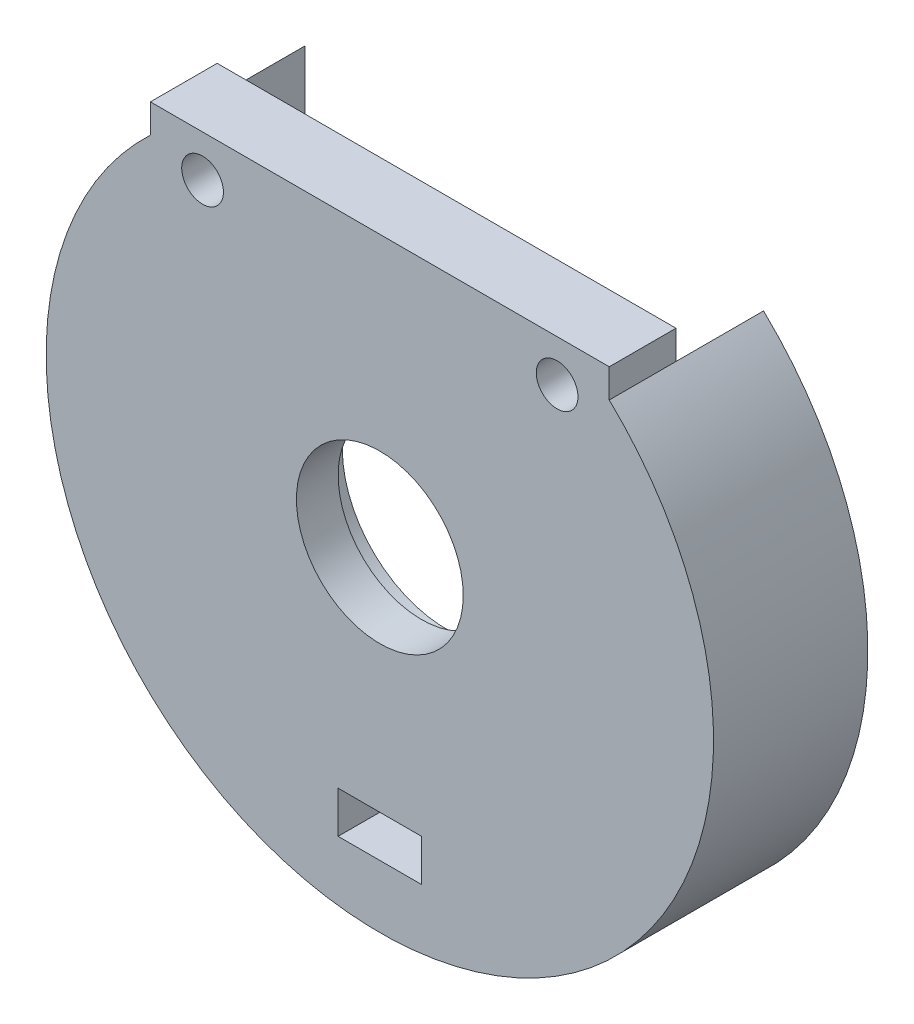
ISO-10303-21;
HEADER;
FILE_DESCRIPTION(('STEP AP214'),'2;1');
FILE_NAME('part.step','',(''),(''),'','','');
FILE_SCHEMA(('AUTOMOTIVE_DESIGN { 1 0 10303 214 1 1 1 1 }'));
ENDSEC;
DATA;
#1=APPLICATION_CONTEXT('core data for automotive mechanical design processes');
#2=APPLICATION_PROTOCOL_DEFINITION('international standard','automotive_design',2000,#1);
#3=PRODUCT_CONTEXT('',#1,'mechanical');
#4=PRODUCT('Part','Part','',(#3));
#5=PRODUCT_RELATED_PRODUCT_CATEGORY('part','',(#4));
#6=PRODUCT_DEFINITION_FORMATION('','',#4);
#7=PRODUCT_DEFINITION_CONTEXT('part definition',#1,'design');
#8=PRODUCT_DEFINITION('design','',#6,#7);
#9=PRODUCT_DEFINITION_SHAPE('','',#8);
#10=(LENGTH_UNIT() NAMED_UNIT(*) SI_UNIT(.MILLI.,.METRE.));
#11=(NAMED_UNIT(*) PLANE_ANGLE_UNIT() SI_UNIT($,.RADIAN.));
#12=(NAMED_UNIT(*) SI_UNIT($,.STERADIAN.) SOLID_ANGLE_UNIT());
#13=UNCERTAINTY_MEASURE_WITH_UNIT(LENGTH_MEASURE(1.E-05),#10,'distance_accuracy_value','');
#14=(GEOMETRIC_REPRESENTATION_CONTEXT(3) GLOBAL_UNCERTAINTY_ASSIGNED_CONTEXT((#13)) GLOBAL_UNIT_ASSIGNED_CONTEXT((#10,
#11,#12)) REPRESENTATION_CONTEXT('',''));
#15=CARTESIAN_POINT('',(0.,0.,0.));
#16=DIRECTION('',(0.,0.,1.));
#17=DIRECTION('',(1.,0.,0.));
#18=AXIS2_PLACEMENT_3D('',#15,#16,#17);
#19=CARTESIAN_POINT('',(-5.49999999999999,-2.50000000000145,1.4));
#20=DIRECTION('',(-0.707106781186376,-0.707106781186719,0.));
#21=DIRECTION('',(0.707106781186719,-0.707106781186376,0.));
#22=AXIS2_PLACEMENT_3D('',#19,#20,#21);
#23=PLANE('',#22);
#24=DIRECTION('',(-0.707106781186719,0.707106781186376,0.));
#25=VECTOR('',#24,1.);
#26=CARTESIAN_POINT('',(-5.49999999999999,-2.50000000000145,0.));
#27=LINE('',#26,#25);
#28=CARTESIAN_POINT('',(-2.49999999999999,-5.5,0.));
#29=VERTEX_POINT('',#28);
#30=CARTESIAN_POINT('',(-5.49999999999999,-2.50000000000145,0.));
#31=VERTEX_POINT('',#30);
#32=EDGE_CURVE('E235',#29,#31,#27,.T.);
#33=ORIENTED_EDGE('',*,*,#32,.T.);
#34=DIRECTION('',(0.,0.,-1.));
#35=VECTOR('',#34,1.);
#36=CARTESIAN_POINT('',(-5.49999999999999,-2.50000000000145,1.4));
#37=LINE('',#36,#35);
#38=CARTESIAN_POINT('',(-5.49999999999999,-2.50000000000145,2.09999999999996));
#39=VERTEX_POINT('',#38);
#40=EDGE_CURVE('E11',#39,#31,#37,.T.);
#41=ORIENTED_EDGE('',*,*,#40,.F.);
#42=DIRECTION('',(-0.707106781186719,0.707106781186376,0.));
#43=VECTOR('',#42,1.);
#44=CARTESIAN_POINT('',(-5.49999999999999,-2.50000000000145,2.09999999999997));
#45=LINE('',#44,#43);
#46=CARTESIAN_POINT('',(-2.49999999999999,-5.5,2.09999999999997));
#47=VERTEX_POINT('',#46);
#48=EDGE_CURVE('E245',#47,#39,#45,.T.);
#49=ORIENTED_EDGE('',*,*,#48,.F.);
#50=DIRECTION('',(0.,0.,-1.));
#51=VECTOR('',#50,1.);
#52=CARTESIAN_POINT('',(-2.49999999999999,-5.5,1.4));
#53=LINE('',#52,#51);
#54=EDGE_CURVE('E257',#47,#29,#53,.T.);
#55=ORIENTED_EDGE('',*,*,#54,.T.);
#56=EDGE_LOOP('',(#33,#41,#49,#55));
#57=FACE_BOUND('',#56,.T.);
#58=ADVANCED_FACE('F35',(#57),#23,.F.);
#59=CARTESIAN_POINT('',(-5.49999999999999,5.80947501931113,1.4));
#60=DIRECTION('',(-1.,0.,0.));
#61=DIRECTION('',(0.,-1.,0.));
#62=AXIS2_PLACEMENT_3D('',#59,#60,#61);
#63=PLANE('',#62);
#64=DIRECTION('',(0.,1.,0.));
#65=VECTOR('',#64,1.);
#66=CARTESIAN_POINT('',(-5.49999999999999,5.80947501931113,0.));
#67=LINE('',#66,#65);
#68=CARTESIAN_POINT('',(-5.49999999999999,5.80947501931113,0.));
#69=VERTEX_POINT('',#68);
#70=EDGE_CURVE('E261',#31,#69,#67,.T.);
#71=ORIENTED_EDGE('',*,*,#70,.T.);
#72=DIRECTION('',(0.,0.,-1.));
#73=VECTOR('',#72,1.);
#74=CARTESIAN_POINT('',(-5.49999999999999,5.80947501931113,1.4));
#75=LINE('',#74,#73);
#76=CARTESIAN_POINT('',(-5.49999999999999,5.80947501931113,2.09999999999996));
#77=VERTEX_POINT('',#76);
#78=EDGE_CURVE('E42',#77,#69,#75,.T.);
#79=ORIENTED_EDGE('',*,*,#78,.F.);
#80=DIRECTION('',(0.,1.,0.));
#81=VECTOR('',#80,1.);
#82=CARTESIAN_POINT('',(-5.49999999999999,-2.50000000000145,2.09999999999996));
#83=LINE('',#82,#81);
#84=EDGE_CURVE('E242',#39,#77,#83,.T.);
#85=ORIENTED_EDGE('',*,*,#84,.F.);
#86=ORIENTED_EDGE('',*,*,#40,.T.);
#87=EDGE_LOOP('',(#71,#79,#85,#86));
#88=FACE_BOUND('',#87,.T.);
#89=ADVANCED_FACE('F315',(#88),#63,.F.);
#90=CARTESIAN_POINT('',(0.,0.,1.4));
#91=DIRECTION('',(0.,0.,-1.));
#92=DIRECTION('',(-1.,0.,0.));
#93=AXIS2_PLACEMENT_3D('',#90,#91,#92);
#94=CYLINDRICAL_SURFACE('',#93,8.);
#95=CARTESIAN_POINT('',(0.,0.,0.));
#96=DIRECTION('',(0.,0.,1.));
#97=DIRECTION('',(1.,0.,0.));
#98=AXIS2_PLACEMENT_3D('',#95,#96,#97);
#99=CIRCLE('',#98,8.);
#100=CARTESIAN_POINT('',(5.50000000000001,5.80947501931112,0.));
#101=VERTEX_POINT('',#100);
#102=EDGE_CURVE('E263',#69,#101,#99,.T.);
#103=ORIENTED_EDGE('',*,*,#102,.T.);
#104=DIRECTION('',(0.,0.,-1.));
#105=VECTOR('',#104,1.);
#106=CARTESIAN_POINT('',(5.50000000000001,5.80947501931112,1.4));
#107=LINE('',#106,#105);
#108=CARTESIAN_POINT('',(5.50000000000001,5.80947501931111,2.09999999999996));
#109=VERTEX_POINT('',#108);
#110=EDGE_CURVE('E278',#109,#101,#107,.T.);
#111=ORIENTED_EDGE('',*,*,#110,.F.);
#112=DIRECTION('',(0.,0.,-1.));
#113=VECTOR('',#112,1.);
#114=CARTESIAN_POINT('',(5.5,5.80947501931111,24.2928228816891));
#115=LINE('',#114,#113);
#116=CARTESIAN_POINT('',(5.50000000000001,5.80947501931111,3.69999999999996));
#117=VERTEX_POINT('',#116);
#118=EDGE_CURVE('E210',#117,#109,#115,.T.);
#119=ORIENTED_EDGE('',*,*,#118,.F.);
#120=CARTESIAN_POINT('',(0.,0.,3.69999999999996));
#121=DIRECTION('',(0.,0.,1.));
#122=DIRECTION('',(1.,0.,0.));
#123=AXIS2_PLACEMENT_3D('',#120,#121,#122);
#124=CIRCLE('',#123,8.);
#125=CARTESIAN_POINT('',(-5.49999999999999,5.80947501931113,3.69999999999996));
#126=VERTEX_POINT('',#125);
#127=EDGE_CURVE('E175',#126,#117,#124,.T.);
#128=ORIENTED_EDGE('',*,*,#127,.F.);
#129=DIRECTION('',(0.,0.,-1.));
#130=VECTOR('',#129,1.);
#131=CARTESIAN_POINT('',(-5.5,5.80947501931113,24.2928228816891));
#132=LINE('',#131,#130);
#133=EDGE_CURVE('E214',#126,#77,#132,.T.);
#134=ORIENTED_EDGE('',*,*,#133,.T.);
#135=ORIENTED_EDGE('',*,*,#78,.T.);
#136=EDGE_LOOP('',(#103,#111,#119,#128,#134,#135));
#137=FACE_BOUND('',#136,.T.);
#138=ADVANCED_FACE('F283',(#137),#94,.T.);
#139=CARTESIAN_POINT('',(5.50000000000001,-2.50000000000145,1.4));
#140=DIRECTION('',(1.,0.,0.));
#141=DIRECTION('',(0.,1.,0.));
#142=AXIS2_PLACEMENT_3D('',#139,#140,#141);
#143=PLANE('',#142);
#144=DIRECTION('',(0.,-1.,0.));
#145=VECTOR('',#144,1.);
#146=CARTESIAN_POINT('',(5.50000000000001,-2.50000000000145,0.));
#147=LINE('',#146,#145);
#148=CARTESIAN_POINT('',(5.50000000000001,-2.50000000000145,0.));
#149=VERTEX_POINT('',#148);
#150=EDGE_CURVE('E265',#101,#149,#147,.T.);
#151=ORIENTED_EDGE('',*,*,#150,.T.);
#152=DIRECTION('',(0.,0.,-1.));
#153=VECTOR('',#152,1.);
#154=CARTESIAN_POINT('',(5.50000000000001,-2.50000000000145,1.4));
#155=LINE('',#154,#153);
#156=CARTESIAN_POINT('',(5.50000000000001,-2.50000000000145,2.09999999999996));
#157=VERTEX_POINT('',#156);
#158=EDGE_CURVE('E275',#157,#149,#155,.T.);
#159=ORIENTED_EDGE('',*,*,#158,.F.);
#160=DIRECTION('',(0.,-1.,0.));
#161=VECTOR('',#160,1.);
#162=CARTESIAN_POINT('',(5.50000000000001,-2.50000000000145,2.09999999999996));
#163=LINE('',#162,#161);
#164=EDGE_CURVE('E239',#109,#157,#163,.T.);
#165=ORIENTED_EDGE('',*,*,#164,.F.);
#166=ORIENTED_EDGE('',*,*,#110,.T.);
#167=EDGE_LOOP('',(#151,#159,#165,#166));
#168=FACE_BOUND('',#167,.T.);
#169=ADVANCED_FACE('F294',(#168),#143,.F.);
#170=CARTESIAN_POINT('',(2.50000000000001,-5.5,1.4));
#171=DIRECTION('',(0.707106781186376,-0.707106781186719,0.));
#172=DIRECTION('',(0.707106781186719,0.707106781186376,0.));
#173=AXIS2_PLACEMENT_3D('',#170,#171,#172);
#174=PLANE('',#173);
#175=DIRECTION('',(-0.707106781186719,-0.707106781186376,0.));
#176=VECTOR('',#175,1.);
#177=CARTESIAN_POINT('',(2.50000000000001,-5.5,0.));
#178=LINE('',#177,#176);
#179=CARTESIAN_POINT('',(2.50000000000001,-5.5,0.));
#180=VERTEX_POINT('',#179);
#181=EDGE_CURVE('E267',#149,#180,#178,.T.);
#182=ORIENTED_EDGE('',*,*,#181,.T.);
#183=DIRECTION('',(0.,0.,-1.));
#184=VECTOR('',#183,1.);
#185=CARTESIAN_POINT('',(2.50000000000001,-5.5,1.4));
#186=LINE('',#185,#184);
#187=CARTESIAN_POINT('',(2.50000000000001,-5.5,2.09999999999996));
#188=VERTEX_POINT('',#187);
#189=EDGE_CURVE('E272',#188,#180,#186,.T.);
#190=ORIENTED_EDGE('',*,*,#189,.F.);
#191=DIRECTION('',(-0.707106781186719,-0.707106781186376,0.));
#192=VECTOR('',#191,1.);
#193=CARTESIAN_POINT('',(2.50000000000001,-5.5,2.09999999999996));
#194=LINE('',#193,#192);
#195=EDGE_CURVE('E236',#157,#188,#194,.T.);
#196=ORIENTED_EDGE('',*,*,#195,.F.);
#197=ORIENTED_EDGE('',*,*,#158,.T.);
#198=EDGE_LOOP('',(#182,#190,#196,#197));
#199=FACE_BOUND('',#198,.T.);
#200=ADVANCED_FACE('F298',(#199),#174,.F.);
#201=CARTESIAN_POINT('',(-2.49999999999999,-5.5,1.4));
#202=DIRECTION('',(0.,-1.,0.));
#203=DIRECTION('',(0.,0.,-1.));
#204=AXIS2_PLACEMENT_3D('',#201,#202,#203);
#205=PLANE('',#204);
#206=DIRECTION('',(-1.,0.,0.));
#207=VECTOR('',#206,1.);
#208=CARTESIAN_POINT('',(-2.49999999999999,-5.5,0.));
#209=LINE('',#208,#207);
#210=EDGE_CURVE('E258',#180,#29,#209,.T.);
#211=ORIENTED_EDGE('',*,*,#210,.T.);
#212=ORIENTED_EDGE('',*,*,#54,.F.);
#213=DIRECTION('',(-1.,0.,0.));
#214=VECTOR('',#213,1.);
#215=CARTESIAN_POINT('',(-2.49999999999999,-5.5,2.09999999999996));
#216=LINE('',#215,#214);
#217=CARTESIAN_POINT('',(-1.,-5.5,2.09999999999996));
#218=VERTEX_POINT('',#217);
#219=EDGE_CURVE('E222',#218,#47,#216,.T.);
#220=ORIENTED_EDGE('',*,*,#219,.F.);
#221=DIRECTION('',(0.,0.,-1.));
#222=VECTOR('',#221,1.);
#223=CARTESIAN_POINT('',(-1.,-5.5,23.2353164232045));
#224=LINE('',#223,#222);
#225=CARTESIAN_POINT('',(-1.,-5.5,1.4));
#226=VERTEX_POINT('',#225);
#227=EDGE_CURVE('E140',#218,#226,#224,.T.);
#228=ORIENTED_EDGE('',*,*,#227,.T.);
#229=DIRECTION('',(-1.,0.,0.));
#230=VECTOR('',#229,1.);
#231=CARTESIAN_POINT('',(-2.49999999999999,-5.5,1.4));
#232=LINE('',#231,#230);
#233=CARTESIAN_POINT('',(1.,-5.5,1.4));
#234=VERTEX_POINT('',#233);
#235=EDGE_CURVE('E54',#234,#226,#232,.T.);
#236=ORIENTED_EDGE('',*,*,#235,.F.);
#237=DIRECTION('',(0.,0.,-1.));
#238=VECTOR('',#237,1.);
#239=CARTESIAN_POINT('',(1.,-5.5,23.2353164232045));
#240=LINE('',#239,#238);
#241=CARTESIAN_POINT('',(1.,-5.5,2.09999999999996));
#242=VERTEX_POINT('',#241);
#243=EDGE_CURVE('E231',#242,#234,#240,.T.);
#244=ORIENTED_EDGE('',*,*,#243,.F.);
#245=DIRECTION('',(-1.,0.,0.));
#246=VECTOR('',#245,1.);
#247=CARTESIAN_POINT('',(1.,-5.5,2.09999999999996));
#248=LINE('',#247,#246);
#249=EDGE_CURVE('E232',#188,#242,#248,.T.);
#250=ORIENTED_EDGE('',*,*,#249,.F.);
#251=ORIENTED_EDGE('',*,*,#189,.T.);
#252=EDGE_LOOP('',(#211,#212,#220,#228,#236,#244,#250,#251));
#253=FACE_BOUND('',#252,.T.);
#254=ADVANCED_FACE('F318',(#253),#205,.F.);
#255=CARTESIAN_POINT('',(0.,0.,1.4));
#256=DIRECTION('',(0.,0.,1.));
#257=DIRECTION('',(1.,0.,0.));
#258=AXIS2_PLACEMENT_3D('',#255,#256,#257);
#259=PLANE('',#258);
#260=DIRECTION('',(0.,1.,0.));
#261=VECTOR('',#260,1.);
#262=CARTESIAN_POINT('',(-1.,-5.5,1.4));
#263=LINE('',#262,#261);
#264=CARTESIAN_POINT('',(-1.,-6.5,1.4));
#265=VERTEX_POINT('',#264);
#266=EDGE_CURVE('E49',#265,#226,#263,.T.);
#267=ORIENTED_EDGE('',*,*,#266,.F.);
#268=DIRECTION('',(-1.,0.,0.));
#269=VECTOR('',#268,1.);
#270=CARTESIAN_POINT('',(-1.,-6.5,1.4));
#271=LINE('',#270,#269);
#272=CARTESIAN_POINT('',(1.,-6.5,1.4));
#273=VERTEX_POINT('',#272);
#274=EDGE_CURVE('E224',#273,#265,#271,.T.);
#275=ORIENTED_EDGE('',*,*,#274,.F.);
#276=DIRECTION('',(0.,-1.,0.));
#277=VECTOR('',#276,1.);
#278=CARTESIAN_POINT('',(1.,-6.5,1.4));
#279=LINE('',#278,#277);
#280=EDGE_CURVE('E228',#234,#273,#279,.T.);
#281=ORIENTED_EDGE('',*,*,#280,.F.);
#282=ORIENTED_EDGE('',*,*,#235,.T.);
#283=EDGE_LOOP('',(#267,#275,#281,#282));
#284=FACE_BOUND('',#283,.T.);
#285=ADVANCED_FACE('F323',(#284),#259,.T.);
#286=CARTESIAN_POINT('',(0.,0.,0.));
#287=DIRECTION('',(0.,0.,1.));
#288=DIRECTION('',(1.,0.,0.));
#289=AXIS2_PLACEMENT_3D('',#286,#287,#288);
#290=PLANE('',#289);
#291=ORIENTED_EDGE('',*,*,#32,.F.);
#292=ORIENTED_EDGE('',*,*,#210,.F.);
#293=ORIENTED_EDGE('',*,*,#181,.F.);
#294=ORIENTED_EDGE('',*,*,#150,.F.);
#295=ORIENTED_EDGE('',*,*,#102,.F.);
#296=ORIENTED_EDGE('',*,*,#70,.F.);
#297=EDGE_LOOP('',(#291,#292,#293,#294,#295,#296));
#298=FACE_BOUND('',#297,.T.);
#299=ADVANCED_FACE('F290',(#298),#290,.F.);
#300=CARTESIAN_POINT('',(1.,-6.5,23.2353164232045));
#301=DIRECTION('',(1.,0.,0.));
#302=DIRECTION('',(0.,1.,0.));
#303=AXIS2_PLACEMENT_3D('',#300,#301,#302);
#304=PLANE('',#303);
#305=DIRECTION('',(0.,0.,-1.));
#306=VECTOR('',#305,1.);
#307=CARTESIAN_POINT('',(1.,-6.5,23.2353164232045));
#308=LINE('',#307,#306);
#309=CARTESIAN_POINT('',(1.,-6.5,3.69999999999996));
#310=VERTEX_POINT('',#309);
#311=EDGE_CURVE('E227',#310,#273,#308,.T.);
#312=ORIENTED_EDGE('',*,*,#311,.F.);
#313=DIRECTION('',(0.,1.,0.));
#314=VECTOR('',#313,1.);
#315=CARTESIAN_POINT('',(1.,-6.5,3.69999999999996));
#316=LINE('',#315,#314);
#317=CARTESIAN_POINT('',(1.,-5.5,3.69999999999996));
#318=VERTEX_POINT('',#317);
#319=EDGE_CURVE('E161',#310,#318,#316,.T.);
#320=ORIENTED_EDGE('',*,*,#319,.T.);
#321=DIRECTION('',(0.,0.,-1.));
#322=VECTOR('',#321,1.);
#323=CARTESIAN_POINT('',(1.,-5.5,24.2928228816891));
#324=LINE('',#323,#322);
#325=EDGE_CURVE('E152',#318,#242,#324,.T.);
#326=ORIENTED_EDGE('',*,*,#325,.T.);
#327=ORIENTED_EDGE('',*,*,#243,.T.);
#328=ORIENTED_EDGE('',*,*,#280,.T.);
#329=EDGE_LOOP('',(#312,#320,#326,#327,#328));
#330=FACE_BOUND('',#329,.T.);
#331=ADVANCED_FACE('F320',(#330),#304,.F.);
#332=CARTESIAN_POINT('',(-1.,-6.5,23.2353164232045));
#333=DIRECTION('',(0.,-1.,0.));
#334=DIRECTION('',(0.,0.,-1.));
#335=AXIS2_PLACEMENT_3D('',#332,#333,#334);
#336=PLANE('',#335);
#337=DIRECTION('',(0.,0.,-1.));
#338=VECTOR('',#337,1.);
#339=CARTESIAN_POINT('',(-1.,-6.5,23.2353164232045));
#340=LINE('',#339,#338);
#341=CARTESIAN_POINT('',(-1.,-6.5,3.69999999999996));
#342=VERTEX_POINT('',#341);
#343=EDGE_CURVE('E223',#342,#265,#340,.T.);
#344=ORIENTED_EDGE('',*,*,#343,.F.);
#345=DIRECTION('',(1.,0.,0.));
#346=VECTOR('',#345,1.);
#347=CARTESIAN_POINT('',(-1.,-6.5,3.69999999999996));
#348=LINE('',#347,#346);
#349=EDGE_CURVE('E159',#342,#310,#348,.T.);
#350=ORIENTED_EDGE('',*,*,#349,.T.);
#351=ORIENTED_EDGE('',*,*,#311,.T.);
#352=ORIENTED_EDGE('',*,*,#274,.T.);
#353=EDGE_LOOP('',(#344,#350,#351,#352));
#354=FACE_BOUND('',#353,.T.);
#355=ADVANCED_FACE('F322',(#354),#336,.F.);
#356=CARTESIAN_POINT('',(-1.,-5.5,23.2353164232045));
#357=DIRECTION('',(-1.,0.,0.));
#358=DIRECTION('',(0.,-1.,0.));
#359=AXIS2_PLACEMENT_3D('',#356,#357,#358);
#360=PLANE('',#359);
#361=ORIENTED_EDGE('',*,*,#227,.F.);
#362=DIRECTION('',(0.,0.,-1.));
#363=VECTOR('',#362,1.);
#364=CARTESIAN_POINT('',(-1.,-5.5,24.2928228816891));
#365=LINE('',#364,#363);
#366=CARTESIAN_POINT('',(-1.,-5.5,3.69999999999996));
#367=VERTEX_POINT('',#366);
#368=EDGE_CURVE('E134',#367,#218,#365,.T.);
#369=ORIENTED_EDGE('',*,*,#368,.F.);
#370=DIRECTION('',(0.,-1.,0.));
#371=VECTOR('',#370,1.);
#372=CARTESIAN_POINT('',(-1.,-5.5,3.69999999999996));
#373=LINE('',#372,#371);
#374=EDGE_CURVE('E138',#367,#342,#373,.T.);
#375=ORIENTED_EDGE('',*,*,#374,.T.);
#376=ORIENTED_EDGE('',*,*,#343,.T.);
#377=ORIENTED_EDGE('',*,*,#266,.T.);
#378=EDGE_LOOP('',(#361,#369,#375,#376,#377));
#379=FACE_BOUND('',#378,.T.);
#380=ADVANCED_FACE('F136',(#379),#360,.F.);
#381=CARTESIAN_POINT('',(0.,0.,2.09999999999996));
#382=DIRECTION('',(0.,0.,1.));
#383=DIRECTION('',(1.,0.,0.));
#384=AXIS2_PLACEMENT_3D('',#381,#382,#383);
#385=PLANE('',#384);
#386=CARTESIAN_POINT('',(4.25000000068948,5.5,2.09999999999996));
#387=DIRECTION('',(0.,0.,1.));
#388=DIRECTION('',(1.,0.,0.));
#389=AXIS2_PLACEMENT_3D('',#386,#387,#388);
#390=CIRCLE('',#389,0.500000000000001);
#391=CARTESIAN_POINT('',(4.75000000068948,5.5,2.09999999999996));
#392=VERTEX_POINT('',#391);
#393=EDGE_CURVE('E196',#392,#392,#390,.F.);
#394=ORIENTED_EDGE('',*,*,#393,.F.);
#395=EDGE_LOOP('',(#394));
#396=FACE_BOUND('',#395,.T.);
#397=CARTESIAN_POINT('',(0.,0.,2.09999999999996));
#398=DIRECTION('',(0.,0.,1.));
#399=DIRECTION('',(1.,0.,0.));
#400=AXIS2_PLACEMENT_3D('',#397,#398,#399);
#401=CIRCLE('',#400,2.5);
#402=CARTESIAN_POINT('',(2.5,0.,2.09999999999996));
#403=VERTEX_POINT('',#402);
#404=EDGE_CURVE('E193',#403,#403,#401,.F.);
#405=ORIENTED_EDGE('',*,*,#404,.F.);
#406=EDGE_LOOP('',(#405));
#407=FACE_BOUND('',#406,.T.);
#408=CARTESIAN_POINT('',(-4.24999999931052,5.5,2.09999999999996));
#409=DIRECTION('',(0.,0.,1.));
#410=DIRECTION('',(1.,0.,0.));
#411=AXIS2_PLACEMENT_3D('',#408,#409,#410);
#412=CIRCLE('',#411,0.500000000000001);
#413=CARTESIAN_POINT('',(-3.74999999931052,5.5,2.09999999999996));
#414=VERTEX_POINT('',#413);
#415=EDGE_CURVE('E188',#414,#414,#412,.F.);
#416=ORIENTED_EDGE('',*,*,#415,.F.);
#417=EDGE_LOOP('',(#416));
#418=FACE_BOUND('',#417,.T.);
#419=DIRECTION('',(1.,0.,0.));
#420=VECTOR('',#419,1.);
#421=CARTESIAN_POINT('',(0.,-5.5,2.09999999999996));
#422=LINE('',#421,#420);
#423=EDGE_CURVE('E145',#218,#242,#422,.T.);
#424=ORIENTED_EDGE('',*,*,#423,.F.);
#425=ORIENTED_EDGE('',*,*,#219,.T.);
#426=ORIENTED_EDGE('',*,*,#48,.T.);
#427=ORIENTED_EDGE('',*,*,#84,.T.);
#428=DIRECTION('',(0.,-1.,0.));
#429=VECTOR('',#428,1.);
#430=CARTESIAN_POINT('',(-5.5,0.,2.09999999999996));
#431=LINE('',#430,#429);
#432=CARTESIAN_POINT('',(-5.5,6.5,2.09999999999996));
#433=VERTEX_POINT('',#432);
#434=EDGE_CURVE('E192',#433,#77,#431,.T.);
#435=ORIENTED_EDGE('',*,*,#434,.F.);
#436=DIRECTION('',(-1.,0.,0.));
#437=VECTOR('',#436,1.);
#438=CARTESIAN_POINT('',(0.,6.5,2.09999999999996));
#439=LINE('',#438,#437);
#440=CARTESIAN_POINT('',(5.5,6.5,2.09999999999996));
#441=VERTEX_POINT('',#440);
#442=EDGE_CURVE('E197',#441,#433,#439,.T.);
#443=ORIENTED_EDGE('',*,*,#442,.F.);
#444=DIRECTION('',(0.,1.,0.));
#445=VECTOR('',#444,1.);
#446=CARTESIAN_POINT('',(5.5,0.,2.09999999999996));
#447=LINE('',#446,#445);
#448=EDGE_CURVE('E207',#109,#441,#447,.T.);
#449=ORIENTED_EDGE('',*,*,#448,.F.);
#450=ORIENTED_EDGE('',*,*,#164,.T.);
#451=ORIENTED_EDGE('',*,*,#195,.T.);
#452=ORIENTED_EDGE('',*,*,#249,.T.);
#453=EDGE_LOOP('',(#424,#425,#426,#427,#435,#443,#449,#450,#451,#452));
#454=FACE_BOUND('',#453,.T.);
#455=ADVANCED_FACE('F302',(#396,#407,#418,#454),#385,.F.);
#456=CARTESIAN_POINT('',(0.,-5.5,24.2928228816891));
#457=DIRECTION('',(0.,1.,0.));
#458=DIRECTION('',(-1.,0.,0.));
#459=AXIS2_PLACEMENT_3D('',#456,#457,#458);
#460=PLANE('',#459);
#461=ORIENTED_EDGE('',*,*,#325,.F.);
#462=DIRECTION('',(-1.,0.,0.));
#463=VECTOR('',#462,1.);
#464=CARTESIAN_POINT('',(1.,-5.5,3.69999999999996));
#465=LINE('',#464,#463);
#466=EDGE_CURVE('E149',#318,#367,#465,.T.);
#467=ORIENTED_EDGE('',*,*,#466,.T.);
#468=ORIENTED_EDGE('',*,*,#368,.T.);
#469=ORIENTED_EDGE('',*,*,#423,.T.);
#470=EDGE_LOOP('',(#461,#467,#468,#469));
#471=FACE_BOUND('',#470,.T.);
#472=ADVANCED_FACE('F150',(#471),#460,.F.);
#473=CARTESIAN_POINT('',(5.5,0.,24.2928228816891));
#474=DIRECTION('',(-1.,0.,0.));
#475=DIRECTION('',(0.,-1.,0.));
#476=AXIS2_PLACEMENT_3D('',#473,#474,#475);
#477=PLANE('',#476);
#478=DIRECTION('',(0.,0.,-1.));
#479=VECTOR('',#478,1.);
#480=CARTESIAN_POINT('',(5.5,6.5,24.2928228816891));
#481=LINE('',#480,#479);
#482=CARTESIAN_POINT('',(5.50000000000001,6.5,3.69999999999996));
#483=VERTEX_POINT('',#482);
#484=EDGE_CURVE('E206',#483,#441,#481,.T.);
#485=ORIENTED_EDGE('',*,*,#484,.F.);
#486=DIRECTION('',(0.,1.,0.));
#487=VECTOR('',#486,1.);
#488=CARTESIAN_POINT('',(5.50000000000001,6.5,3.69999999999996));
#489=LINE('',#488,#487);
#490=EDGE_CURVE('E180',#117,#483,#489,.T.);
#491=ORIENTED_EDGE('',*,*,#490,.F.);
#492=ORIENTED_EDGE('',*,*,#118,.T.);
#493=ORIENTED_EDGE('',*,*,#448,.T.);
#494=EDGE_LOOP('',(#485,#491,#492,#493));
#495=FACE_BOUND('',#494,.T.);
#496=ADVANCED_FACE('F306',(#495),#477,.F.);
#497=CARTESIAN_POINT('',(0.,6.5,24.2928228816891));
#498=DIRECTION('',(0.,-1.,0.));
#499=DIRECTION('',(1.,0.,0.));
#500=AXIS2_PLACEMENT_3D('',#497,#498,#499);
#501=PLANE('',#500);
#502=DIRECTION('',(0.,0.,-1.));
#503=VECTOR('',#502,1.);
#504=CARTESIAN_POINT('',(-5.5,6.5,24.2928228816891));
#505=LINE('',#504,#503);
#506=CARTESIAN_POINT('',(-5.49999999999999,6.5,3.69999999999996));
#507=VERTEX_POINT('',#506);
#508=EDGE_CURVE('E200',#507,#433,#505,.T.);
#509=ORIENTED_EDGE('',*,*,#508,.F.);
#510=DIRECTION('',(-1.,0.,0.));
#511=VECTOR('',#510,1.);
#512=CARTESIAN_POINT('',(-5.49999999999999,6.5,3.69999999999996));
#513=LINE('',#512,#511);
#514=EDGE_CURVE('E183',#483,#507,#513,.T.);
#515=ORIENTED_EDGE('',*,*,#514,.F.);
#516=ORIENTED_EDGE('',*,*,#484,.T.);
#517=ORIENTED_EDGE('',*,*,#442,.T.);
#518=EDGE_LOOP('',(#509,#515,#516,#517));
#519=FACE_BOUND('',#518,.T.);
#520=ADVANCED_FACE('F379',(#519),#501,.F.);
#521=CARTESIAN_POINT('',(0.,0.,24.2928228816891));
#522=DIRECTION('',(0.,0.,-1.));
#523=DIRECTION('',(-1.,0.,0.));
#524=AXIS2_PLACEMENT_3D('',#521,#522,#523);
#525=CYLINDRICAL_SURFACE('',#524,2.5);
#526=ORIENTED_EDGE('',*,*,#404,.T.);
#527=EDGE_LOOP('',(#526));
#528=FACE_BOUND('',#527,.T.);
#529=CARTESIAN_POINT('',(0.,0.,2.69999999999996));
#530=DIRECTION('',(0.,0.,1.));
#531=DIRECTION('',(1.,0.,0.));
#532=AXIS2_PLACEMENT_3D('',#529,#530,#531);
#533=CIRCLE('',#532,2.5);
#534=CARTESIAN_POINT('',(2.5,0.,2.69999999999996));
#535=VERTEX_POINT('',#534);
#536=EDGE_CURVE('E191',#535,#535,#533,.F.);
#537=ORIENTED_EDGE('',*,*,#536,.F.);
#538=EDGE_LOOP('',(#537));
#539=FACE_BOUND('',#538,.T.);
#540=ADVANCED_FACE('F373',(#528,#539),#525,.F.);
#541=CARTESIAN_POINT('',(4.25000000068948,5.5,24.2928228816891));
#542=DIRECTION('',(0.,0.,-1.));
#543=DIRECTION('',(-1.,0.,0.));
#544=AXIS2_PLACEMENT_3D('',#541,#542,#543);
#545=CYLINDRICAL_SURFACE('',#544,0.500000000000001);
#546=ORIENTED_EDGE('',*,*,#393,.T.);
#547=EDGE_LOOP('',(#546));
#548=FACE_BOUND('',#547,.T.);
#549=CARTESIAN_POINT('',(4.25000000068948,5.5,3.69999999999996));
#550=DIRECTION('',(0.,0.,1.));
#551=DIRECTION('',(1.,0.,0.));
#552=AXIS2_PLACEMENT_3D('',#549,#550,#551);
#553=CIRCLE('',#552,0.5);
#554=CARTESIAN_POINT('',(4.75000000068948,5.5,3.69999999999996));
#555=VERTEX_POINT('',#554);
#556=EDGE_CURVE('E165',#555,#555,#553,.T.);
#557=ORIENTED_EDGE('',*,*,#556,.T.);
#558=EDGE_LOOP('',(#557));
#559=FACE_BOUND('',#558,.T.);
#560=ADVANCED_FACE('F378',(#548,#559),#545,.F.);
#561=CARTESIAN_POINT('',(-5.5,0.,24.2928228816891));
#562=DIRECTION('',(1.,0.,0.));
#563=DIRECTION('',(0.,1.,0.));
#564=AXIS2_PLACEMENT_3D('',#561,#562,#563);
#565=PLANE('',#564);
#566=ORIENTED_EDGE('',*,*,#133,.F.);
#567=DIRECTION('',(0.,-1.,0.));
#568=VECTOR('',#567,1.);
#569=CARTESIAN_POINT('',(-5.49999999999999,5.80947501931113,3.69999999999996));
#570=LINE('',#569,#568);
#571=EDGE_CURVE('E146',#507,#126,#570,.T.);
#572=ORIENTED_EDGE('',*,*,#571,.F.);
#573=ORIENTED_EDGE('',*,*,#508,.T.);
#574=ORIENTED_EDGE('',*,*,#434,.T.);
#575=EDGE_LOOP('',(#566,#572,#573,#574));
#576=FACE_BOUND('',#575,.T.);
#577=ADVANCED_FACE('F312',(#576),#565,.F.);
#578=CARTESIAN_POINT('',(-4.24999999931052,5.5,24.2928228816891));
#579=DIRECTION('',(0.,0.,-1.));
#580=DIRECTION('',(-1.,0.,0.));
#581=AXIS2_PLACEMENT_3D('',#578,#579,#580);
#582=CYLINDRICAL_SURFACE('',#581,0.500000000000001);
#583=ORIENTED_EDGE('',*,*,#415,.T.);
#584=EDGE_LOOP('',(#583));
#585=FACE_BOUND('',#584,.T.);
#586=CARTESIAN_POINT('',(-4.24999999931052,5.5,3.69999999999996));
#587=DIRECTION('',(0.,0.,1.));
#588=DIRECTION('',(1.,0.,0.));
#589=AXIS2_PLACEMENT_3D('',#586,#587,#588);
#590=CIRCLE('',#589,0.5);
#591=CARTESIAN_POINT('',(-3.74999999931052,5.5,3.69999999999996));
#592=VERTEX_POINT('',#591);
#593=EDGE_CURVE('E168',#592,#592,#590,.T.);
#594=ORIENTED_EDGE('',*,*,#593,.T.);
#595=EDGE_LOOP('',(#594));
#596=FACE_BOUND('',#595,.T.);
#597=ADVANCED_FACE('F461',(#585,#596),#582,.F.);
#598=CARTESIAN_POINT('',(0.,0.,2.69999999999996));
#599=DIRECTION('',(0.,0.,1.));
#600=DIRECTION('',(1.,0.,0.));
#601=AXIS2_PLACEMENT_3D('',#598,#599,#600);
#602=PLANE('',#601);
#603=CARTESIAN_POINT('',(0.,0.,2.69999999999996));
#604=DIRECTION('',(0.,0.,1.));
#605=DIRECTION('',(1.,0.,0.));
#606=AXIS2_PLACEMENT_3D('',#603,#604,#605);
#607=CIRCLE('',#606,2.);
#608=CARTESIAN_POINT('',(2.,0.,2.69999999999996));
#609=VERTEX_POINT('',#608);
#610=EDGE_CURVE('E171',#609,#609,#607,.T.);
#611=ORIENTED_EDGE('',*,*,#610,.T.);
#612=EDGE_LOOP('',(#611));
#613=FACE_BOUND('',#612,.T.);
#614=ORIENTED_EDGE('',*,*,#536,.T.);
#615=EDGE_LOOP('',(#614));
#616=FACE_BOUND('',#615,.T.);
#617=ADVANCED_FACE('F471',(#613,#616),#602,.F.);
#618=CARTESIAN_POINT('',(0.,0.,3.69999999999996));
#619=DIRECTION('',(0.,0.,1.));
#620=DIRECTION('',(1.,0.,0.));
#621=AXIS2_PLACEMENT_3D('',#618,#619,#620);
#622=PLANE('',#621);
#623=ORIENTED_EDGE('',*,*,#593,.F.);
#624=EDGE_LOOP('',(#623));
#625=FACE_BOUND('',#624,.T.);
#626=ORIENTED_EDGE('',*,*,#127,.T.);
#627=ORIENTED_EDGE('',*,*,#490,.T.);
#628=ORIENTED_EDGE('',*,*,#514,.T.);
#629=ORIENTED_EDGE('',*,*,#571,.T.);
#630=EDGE_LOOP('',(#626,#627,#628,#629));
#631=FACE_BOUND('',#630,.T.);
#632=CARTESIAN_POINT('',(0.,0.,3.69999999999996));
#633=DIRECTION('',(0.,0.,1.));
#634=DIRECTION('',(1.,0.,0.));
#635=AXIS2_PLACEMENT_3D('',#632,#633,#634);
#636=CIRCLE('',#635,2.);
#637=CARTESIAN_POINT('',(2.,0.,3.69999999999996));
#638=VERTEX_POINT('',#637);
#639=EDGE_CURVE('E172',#638,#638,#636,.T.);
#640=ORIENTED_EDGE('',*,*,#639,.F.);
#641=EDGE_LOOP('',(#640));
#642=FACE_BOUND('',#641,.T.);
#643=ORIENTED_EDGE('',*,*,#556,.F.);
#644=EDGE_LOOP('',(#643));
#645=FACE_BOUND('',#644,.T.);
#646=ORIENTED_EDGE('',*,*,#374,.F.);
#647=ORIENTED_EDGE('',*,*,#466,.F.);
#648=ORIENTED_EDGE('',*,*,#319,.F.);
#649=ORIENTED_EDGE('',*,*,#349,.F.);
#650=EDGE_LOOP('',(#646,#647,#648,#649));
#651=FACE_BOUND('',#650,.T.);
#652=ADVANCED_FACE('F157',(#625,#631,#642,#645,#651),#622,.T.);
#653=CARTESIAN_POINT('',(0.,0.,3.69999999999996));
#654=DIRECTION('',(0.,0.,-1.));
#655=DIRECTION('',(-1.,0.,0.));
#656=AXIS2_PLACEMENT_3D('',#653,#654,#655);
#657=CYLINDRICAL_SURFACE('',#656,2.);
#658=ORIENTED_EDGE('',*,*,#639,.T.);
#659=EDGE_LOOP('',(#658));
#660=FACE_BOUND('',#659,.T.);
#661=ORIENTED_EDGE('',*,*,#610,.F.);
#662=EDGE_LOOP('',(#661));
#663=FACE_BOUND('',#662,.T.);
#664=ADVANCED_FACE('F490',(#660,#663),#657,.F.);
#665=CLOSED_SHELL('',(#58,#89,#138,#169,#200,#254,#285,#299,#331,#355,#380,#455,#472,#496,#520,
#540,#560,#577,#597,#617,#652,#664));
#666=MANIFOLD_SOLID_BREP('B2',#665);
#667=ADVANCED_BREP_SHAPE_REPRESENTATION('',(#18,#666),#14);
#668=SHAPE_DEFINITION_REPRESENTATION(#9,#667);
ENDSEC;
END-ISO-10303-21;
